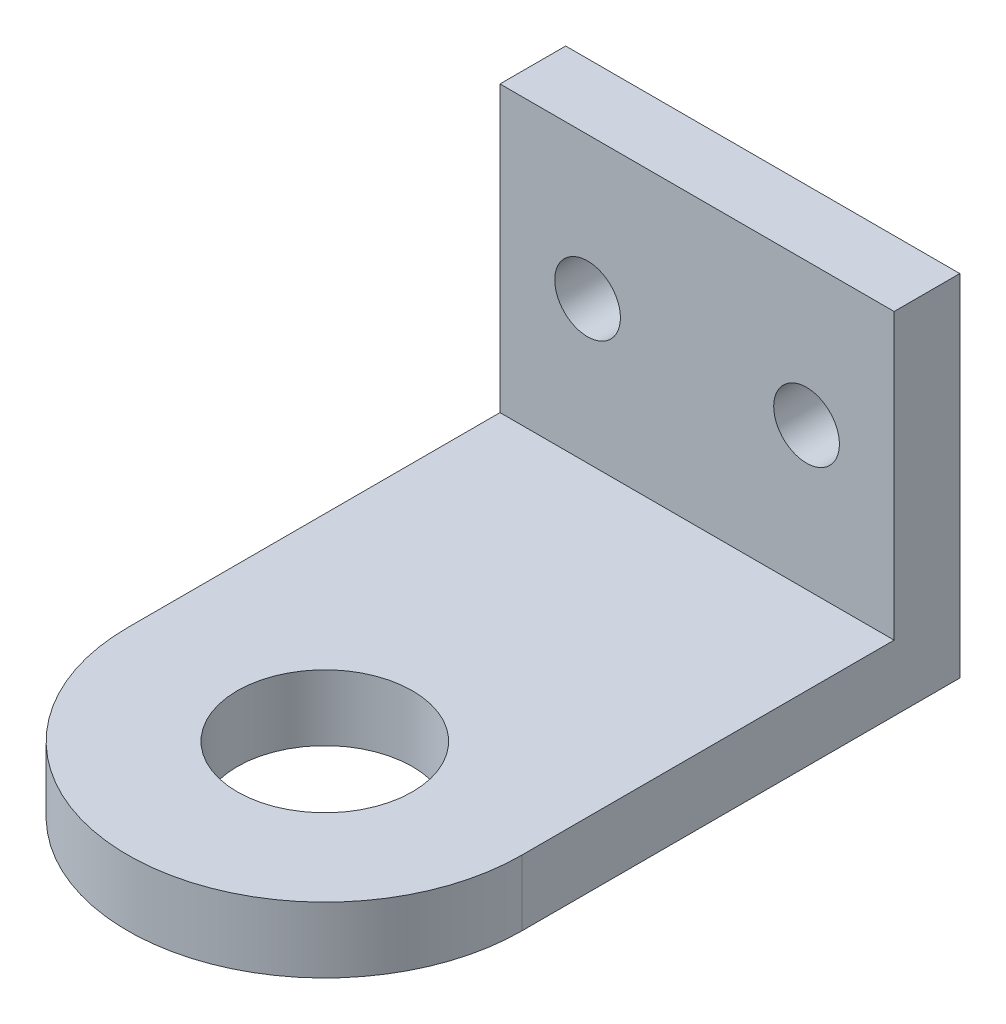
ISO-10303-21;
HEADER;
FILE_DESCRIPTION(('STEP AP214'),'2;1');
FILE_NAME('part.step','',(''),(''),'','','');
FILE_SCHEMA(('AUTOMOTIVE_DESIGN { 1 0 10303 214 1 1 1 1 }'));
ENDSEC;
DATA;
#1=APPLICATION_CONTEXT('core data for automotive mechanical design processes');
#2=APPLICATION_PROTOCOL_DEFINITION('international standard','automotive_design',2000,#1);
#3=PRODUCT_CONTEXT('',#1,'mechanical');
#4=PRODUCT('Part','Part','',(#3));
#5=PRODUCT_RELATED_PRODUCT_CATEGORY('part','',(#4));
#6=PRODUCT_DEFINITION_FORMATION('','',#4);
#7=PRODUCT_DEFINITION_CONTEXT('part definition',#1,'design');
#8=PRODUCT_DEFINITION('design','',#6,#7);
#9=PRODUCT_DEFINITION_SHAPE('','',#8);
#10=(LENGTH_UNIT() NAMED_UNIT(*) SI_UNIT(.MILLI.,.METRE.));
#11=(NAMED_UNIT(*) PLANE_ANGLE_UNIT() SI_UNIT($,.RADIAN.));
#12=(NAMED_UNIT(*) SI_UNIT($,.STERADIAN.) SOLID_ANGLE_UNIT());
#13=UNCERTAINTY_MEASURE_WITH_UNIT(LENGTH_MEASURE(1.E-05),#10,'distance_accuracy_value','');
#14=(GEOMETRIC_REPRESENTATION_CONTEXT(3) GLOBAL_UNCERTAINTY_ASSIGNED_CONTEXT((#13)) GLOBAL_UNIT_ASSIGNED_CONTEXT((#10,
#11,#12)) REPRESENTATION_CONTEXT('',''));
#15=CARTESIAN_POINT('',(0.,0.,0.));
#16=DIRECTION('',(0.,0.,1.));
#17=DIRECTION('',(1.,0.,0.));
#18=AXIS2_PLACEMENT_3D('',#15,#16,#17);
#19=CARTESIAN_POINT('',(0.,0.,3.));
#20=DIRECTION('',(0.,0.,1.));
#21=DIRECTION('',(1.,0.,0.));
#22=AXIS2_PLACEMENT_3D('',#19,#20,#21);
#23=PLANE('',#22);
#24=CARTESIAN_POINT('',(4.99999999999999,1.5,3.));
#25=DIRECTION('',(0.,0.,1.));
#26=DIRECTION('',(-1.,0.,0.));
#27=AXIS2_PLACEMENT_3D('',#24,#25,#26);
#28=CIRCLE('',#27,1.5);
#29=CARTESIAN_POINT('',(3.49999999999999,1.5,3.));
#30=VERTEX_POINT('',#29);
#31=EDGE_CURVE('E118',#30,#30,#28,.T.);
#32=ORIENTED_EDGE('',*,*,#31,.F.);
#33=EDGE_LOOP('',(#32));
#34=FACE_BOUND('',#33,.T.);
#35=CARTESIAN_POINT('',(-5.,1.5,3.));
#36=DIRECTION('',(0.,0.,1.));
#37=DIRECTION('',(1.,0.,0.));
#38=AXIS2_PLACEMENT_3D('',#35,#36,#37);
#39=CIRCLE('',#38,1.5);
#40=CARTESIAN_POINT('',(-3.5,1.5,3.));
#41=VERTEX_POINT('',#40);
#42=EDGE_CURVE('E124',#41,#41,#39,.T.);
#43=ORIENTED_EDGE('',*,*,#42,.F.);
#44=EDGE_LOOP('',(#43));
#45=FACE_BOUND('',#44,.T.);
#46=DIRECTION('',(0.,-1.,0.));
#47=VECTOR('',#46,1.);
#48=CARTESIAN_POINT('',(-9.,8.,3.));
#49=LINE('',#48,#47);
#50=CARTESIAN_POINT('',(-9.,8.,3.));
#51=VERTEX_POINT('',#50);
#52=CARTESIAN_POINT('',(-9.,-5.,3.));
#53=VERTEX_POINT('',#52);
#54=EDGE_CURVE('E55',#51,#53,#49,.T.);
#55=ORIENTED_EDGE('',*,*,#54,.T.);
#56=DIRECTION('',(1.,0.,0.));
#57=VECTOR('',#56,1.);
#58=CARTESIAN_POINT('',(0.,-5.,3.));
#59=LINE('',#58,#57);
#60=CARTESIAN_POINT('',(9.,-5.,3.));
#61=VERTEX_POINT('',#60);
#62=EDGE_CURVE('E50',#53,#61,#59,.T.);
#63=ORIENTED_EDGE('',*,*,#62,.T.);
#64=DIRECTION('',(0.,1.,0.));
#65=VECTOR('',#64,1.);
#66=CARTESIAN_POINT('',(9.,8.,3.));
#67=LINE('',#66,#65);
#68=CARTESIAN_POINT('',(9.,8.,3.));
#69=VERTEX_POINT('',#68);
#70=EDGE_CURVE('E92',#61,#69,#67,.T.);
#71=ORIENTED_EDGE('',*,*,#70,.T.);
#72=DIRECTION('',(-1.,0.,0.));
#73=VECTOR('',#72,1.);
#74=CARTESIAN_POINT('',(-9.,8.,3.));
#75=LINE('',#74,#73);
#76=EDGE_CURVE('E131',#69,#51,#75,.T.);
#77=ORIENTED_EDGE('',*,*,#76,.T.);
#78=EDGE_LOOP('',(#55,#63,#71,#77));
#79=FACE_BOUND('',#78,.T.);
#80=ADVANCED_FACE('F35',(#34,#45,#79),#23,.T.);
#81=CARTESIAN_POINT('',(0.,0.,0.));
#82=DIRECTION('',(0.,0.,1.));
#83=DIRECTION('',(1.,0.,0.));
#84=AXIS2_PLACEMENT_3D('',#81,#82,#83);
#85=PLANE('',#84);
#86=DIRECTION('',(1.,0.,0.));
#87=VECTOR('',#86,1.);
#88=CARTESIAN_POINT('',(-9.,-8.,0.));
#89=LINE('',#88,#87);
#90=CARTESIAN_POINT('',(-9.,-8.,0.));
#91=VERTEX_POINT('',#90);
#92=CARTESIAN_POINT('',(9.,-8.,0.));
#93=VERTEX_POINT('',#92);
#94=EDGE_CURVE('E132',#91,#93,#89,.T.);
#95=ORIENTED_EDGE('',*,*,#94,.F.);
#96=DIRECTION('',(0.,-1.,0.));
#97=VECTOR('',#96,1.);
#98=CARTESIAN_POINT('',(-9.,8.,0.));
#99=LINE('',#98,#97);
#100=CARTESIAN_POINT('',(-9.,8.,0.));
#101=VERTEX_POINT('',#100);
#102=EDGE_CURVE('E139',#101,#91,#99,.T.);
#103=ORIENTED_EDGE('',*,*,#102,.F.);
#104=DIRECTION('',(-1.,0.,0.));
#105=VECTOR('',#104,1.);
#106=CARTESIAN_POINT('',(-9.,8.,0.));
#107=LINE('',#106,#105);
#108=CARTESIAN_POINT('',(9.,8.,0.));
#109=VERTEX_POINT('',#108);
#110=EDGE_CURVE('E137',#109,#101,#107,.T.);
#111=ORIENTED_EDGE('',*,*,#110,.F.);
#112=DIRECTION('',(0.,1.,0.));
#113=VECTOR('',#112,1.);
#114=CARTESIAN_POINT('',(9.,8.,0.));
#115=LINE('',#114,#113);
#116=EDGE_CURVE('E127',#93,#109,#115,.T.);
#117=ORIENTED_EDGE('',*,*,#116,.F.);
#118=EDGE_LOOP('',(#95,#103,#111,#117));
#119=FACE_BOUND('',#118,.T.);
#120=CARTESIAN_POINT('',(4.99999999999999,1.5,0.));
#121=DIRECTION('',(0.,0.,1.));
#122=DIRECTION('',(-1.,0.,0.));
#123=AXIS2_PLACEMENT_3D('',#120,#121,#122);
#124=CIRCLE('',#123,1.5);
#125=CARTESIAN_POINT('',(3.49999999999999,1.5,0.));
#126=VERTEX_POINT('',#125);
#127=EDGE_CURVE('E117',#126,#126,#124,.T.);
#128=ORIENTED_EDGE('',*,*,#127,.T.);
#129=EDGE_LOOP('',(#128));
#130=FACE_BOUND('',#129,.T.);
#131=CARTESIAN_POINT('',(-5.,1.5,0.));
#132=DIRECTION('',(0.,0.,1.));
#133=DIRECTION('',(1.,0.,0.));
#134=AXIS2_PLACEMENT_3D('',#131,#132,#133);
#135=CIRCLE('',#134,1.5);
#136=CARTESIAN_POINT('',(-3.5,1.5,0.));
#137=VERTEX_POINT('',#136);
#138=EDGE_CURVE('E121',#137,#137,#135,.T.);
#139=ORIENTED_EDGE('',*,*,#138,.T.);
#140=EDGE_LOOP('',(#139));
#141=FACE_BOUND('',#140,.T.);
#142=ADVANCED_FACE('F155',(#119,#130,#141),#85,.F.);
#143=CARTESIAN_POINT('',(9.,8.,3.));
#144=DIRECTION('',(-1.,0.,0.));
#145=DIRECTION('',(0.,0.,1.));
#146=AXIS2_PLACEMENT_3D('',#143,#144,#145);
#147=PLANE('',#146);
#148=ORIENTED_EDGE('',*,*,#116,.T.);
#149=DIRECTION('',(0.,0.,-1.));
#150=VECTOR('',#149,1.);
#151=CARTESIAN_POINT('',(9.,8.,3.));
#152=LINE('',#151,#150);
#153=EDGE_CURVE('E11',#69,#109,#152,.T.);
#154=ORIENTED_EDGE('',*,*,#153,.F.);
#155=ORIENTED_EDGE('',*,*,#70,.F.);
#156=DIRECTION('',(0.,0.,1.));
#157=VECTOR('',#156,1.);
#158=CARTESIAN_POINT('',(9.,-5.,0.));
#159=LINE('',#158,#157);
#160=CARTESIAN_POINT('',(9.,-5.,20.));
#161=VERTEX_POINT('',#160);
#162=EDGE_CURVE('E86',#61,#161,#159,.T.);
#163=ORIENTED_EDGE('',*,*,#162,.T.);
#164=DIRECTION('',(0.,-1.,0.));
#165=VECTOR('',#164,1.);
#166=CARTESIAN_POINT('',(9.,-5.,20.));
#167=LINE('',#166,#165);
#168=CARTESIAN_POINT('',(9.,-8.,20.));
#169=VERTEX_POINT('',#168);
#170=EDGE_CURVE('E89',#161,#169,#167,.T.);
#171=ORIENTED_EDGE('',*,*,#170,.T.);
#172=DIRECTION('',(0.,0.,-1.));
#173=VECTOR('',#172,1.);
#174=CARTESIAN_POINT('',(9.,-8.,3.));
#175=LINE('',#174,#173);
#176=EDGE_CURVE('E135',#169,#93,#175,.T.);
#177=ORIENTED_EDGE('',*,*,#176,.T.);
#178=EDGE_LOOP('',(#148,#154,#155,#163,#171,#177));
#179=FACE_BOUND('',#178,.T.);
#180=ADVANCED_FACE('F37',(#179),#147,.F.);
#181=CARTESIAN_POINT('',(-9.,8.,3.));
#182=DIRECTION('',(0.,-1.,0.));
#183=DIRECTION('',(0.,0.,-1.));
#184=AXIS2_PLACEMENT_3D('',#181,#182,#183);
#185=PLANE('',#184);
#186=ORIENTED_EDGE('',*,*,#110,.T.);
#187=DIRECTION('',(0.,0.,-1.));
#188=VECTOR('',#187,1.);
#189=CARTESIAN_POINT('',(-9.,8.,3.));
#190=LINE('',#189,#188);
#191=EDGE_CURVE('E43',#51,#101,#190,.T.);
#192=ORIENTED_EDGE('',*,*,#191,.F.);
#193=ORIENTED_EDGE('',*,*,#76,.F.);
#194=ORIENTED_EDGE('',*,*,#153,.T.);
#195=EDGE_LOOP('',(#186,#192,#193,#194));
#196=FACE_BOUND('',#195,.T.);
#197=ADVANCED_FACE('F161',(#196),#185,.F.);
#198=CARTESIAN_POINT('',(-9.,8.,3.));
#199=DIRECTION('',(1.,0.,0.));
#200=DIRECTION('',(0.,0.,-1.));
#201=AXIS2_PLACEMENT_3D('',#198,#199,#200);
#202=PLANE('',#201);
#203=DIRECTION('',(0.,0.,-1.));
#204=VECTOR('',#203,1.);
#205=CARTESIAN_POINT('',(-9.,-8.,3.));
#206=LINE('',#205,#204);
#207=CARTESIAN_POINT('',(-9.,-8.,20.));
#208=VERTEX_POINT('',#207);
#209=EDGE_CURVE('E143',#208,#91,#206,.T.);
#210=ORIENTED_EDGE('',*,*,#209,.F.);
#211=DIRECTION('',(0.,-1.,0.));
#212=VECTOR('',#211,1.);
#213=CARTESIAN_POINT('',(-9.,-5.,20.));
#214=LINE('',#213,#212);
#215=CARTESIAN_POINT('',(-9.,-5.,20.));
#216=VERTEX_POINT('',#215);
#217=EDGE_CURVE('E104',#216,#208,#214,.T.);
#218=ORIENTED_EDGE('',*,*,#217,.F.);
#219=DIRECTION('',(0.,0.,-1.));
#220=VECTOR('',#219,1.);
#221=CARTESIAN_POINT('',(-9.,-5.,20.));
#222=LINE('',#221,#220);
#223=EDGE_CURVE('E96',#216,#53,#222,.T.);
#224=ORIENTED_EDGE('',*,*,#223,.T.);
#225=ORIENTED_EDGE('',*,*,#54,.F.);
#226=ORIENTED_EDGE('',*,*,#191,.T.);
#227=ORIENTED_EDGE('',*,*,#102,.T.);
#228=EDGE_LOOP('',(#210,#218,#224,#225,#226,#227));
#229=FACE_BOUND('',#228,.T.);
#230=ADVANCED_FACE('F149',(#229),#202,.F.);
#231=CARTESIAN_POINT('',(-9.,-8.,3.));
#232=DIRECTION('',(0.,1.,0.));
#233=DIRECTION('',(0.,0.,1.));
#234=AXIS2_PLACEMENT_3D('',#231,#232,#233);
#235=PLANE('',#234);
#236=ORIENTED_EDGE('',*,*,#94,.T.);
#237=ORIENTED_EDGE('',*,*,#176,.F.);
#238=CARTESIAN_POINT('',(0.,-8.,20.));
#239=DIRECTION('',(0.,-1.,0.));
#240=DIRECTION('',(0.,0.,-1.));
#241=AXIS2_PLACEMENT_3D('',#238,#239,#240);
#242=CIRCLE('',#241,9.);
#243=EDGE_CURVE('E103',#169,#208,#242,.T.);
#244=ORIENTED_EDGE('',*,*,#243,.T.);
#245=ORIENTED_EDGE('',*,*,#209,.T.);
#246=EDGE_LOOP('',(#236,#237,#244,#245));
#247=FACE_BOUND('',#246,.T.);
#248=CARTESIAN_POINT('',(0.,-8.,20.));
#249=DIRECTION('',(0.,-1.,0.));
#250=DIRECTION('',(0.,0.,-1.));
#251=AXIS2_PLACEMENT_3D('',#248,#249,#250);
#252=CIRCLE('',#251,4.);
#253=CARTESIAN_POINT('',(0.,-8.,16.));
#254=VERTEX_POINT('',#253);
#255=EDGE_CURVE('E266',#254,#254,#252,.T.);
#256=ORIENTED_EDGE('',*,*,#255,.F.);
#257=EDGE_LOOP('',(#256));
#258=FACE_BOUND('',#257,.T.);
#259=ADVANCED_FACE('F159',(#247,#258),#235,.F.);
#260=CARTESIAN_POINT('',(-5.,1.5,3.));
#261=DIRECTION('',(0.,0.,-1.));
#262=DIRECTION('',(-1.,0.,0.));
#263=AXIS2_PLACEMENT_3D('',#260,#261,#262);
#264=CYLINDRICAL_SURFACE('',#263,1.5);
#265=ORIENTED_EDGE('',*,*,#42,.T.);
#266=EDGE_LOOP('',(#265));
#267=FACE_BOUND('',#266,.T.);
#268=ORIENTED_EDGE('',*,*,#138,.F.);
#269=EDGE_LOOP('',(#268));
#270=FACE_BOUND('',#269,.T.);
#271=ADVANCED_FACE('F172',(#267,#270),#264,.F.);
#272=CARTESIAN_POINT('',(4.99999999999999,1.5,3.));
#273=DIRECTION('',(0.,0.,-1.));
#274=DIRECTION('',(-1.,0.,0.));
#275=AXIS2_PLACEMENT_3D('',#272,#273,#274);
#276=CYLINDRICAL_SURFACE('',#275,1.5);
#277=ORIENTED_EDGE('',*,*,#31,.T.);
#278=EDGE_LOOP('',(#277));
#279=FACE_BOUND('',#278,.T.);
#280=ORIENTED_EDGE('',*,*,#127,.F.);
#281=EDGE_LOOP('',(#280));
#282=FACE_BOUND('',#281,.T.);
#283=ADVANCED_FACE('F200',(#279,#282),#276,.F.);
#284=CARTESIAN_POINT('',(0.,-5.,20.));
#285=DIRECTION('',(0.,-1.,0.));
#286=DIRECTION('',(0.,0.,-1.));
#287=AXIS2_PLACEMENT_3D('',#284,#285,#286);
#288=CYLINDRICAL_SURFACE('',#287,9.);
#289=ORIENTED_EDGE('',*,*,#243,.F.);
#290=ORIENTED_EDGE('',*,*,#170,.F.);
#291=CARTESIAN_POINT('',(0.,-5.,20.));
#292=DIRECTION('',(0.,-1.,0.));
#293=DIRECTION('',(0.,0.,-1.));
#294=AXIS2_PLACEMENT_3D('',#291,#292,#293);
#295=CIRCLE('',#294,9.);
#296=EDGE_CURVE('E95',#161,#216,#295,.T.);
#297=ORIENTED_EDGE('',*,*,#296,.T.);
#298=ORIENTED_EDGE('',*,*,#217,.T.);
#299=EDGE_LOOP('',(#289,#290,#297,#298));
#300=FACE_BOUND('',#299,.T.);
#301=ADVANCED_FACE('F100',(#300),#288,.T.);
#302=CARTESIAN_POINT('',(0.,-5.,20.));
#303=DIRECTION('',(0.,-1.,0.));
#304=DIRECTION('',(0.,0.,-1.));
#305=AXIS2_PLACEMENT_3D('',#302,#303,#304);
#306=PLANE('',#305);
#307=ORIENTED_EDGE('',*,*,#62,.F.);
#308=ORIENTED_EDGE('',*,*,#223,.F.);
#309=ORIENTED_EDGE('',*,*,#296,.F.);
#310=ORIENTED_EDGE('',*,*,#162,.F.);
#311=EDGE_LOOP('',(#307,#308,#309,#310));
#312=FACE_BOUND('',#311,.T.);
#313=CARTESIAN_POINT('',(0.,-5.,20.));
#314=DIRECTION('',(0.,-1.,0.));
#315=DIRECTION('',(0.,0.,-1.));
#316=AXIS2_PLACEMENT_3D('',#313,#314,#315);
#317=CIRCLE('',#316,4.);
#318=CARTESIAN_POINT('',(0.,-5.,16.));
#319=VERTEX_POINT('',#318);
#320=EDGE_CURVE('E114',#319,#319,#317,.T.);
#321=ORIENTED_EDGE('',*,*,#320,.T.);
#322=EDGE_LOOP('',(#321));
#323=FACE_BOUND('',#322,.T.);
#324=ADVANCED_FACE('F107',(#312,#323),#306,.F.);
#325=CARTESIAN_POINT('',(0.,-5.,20.));
#326=DIRECTION('',(0.,-1.,0.));
#327=DIRECTION('',(0.,0.,-1.));
#328=AXIS2_PLACEMENT_3D('',#325,#326,#327);
#329=CYLINDRICAL_SURFACE('',#328,4.);
#330=ORIENTED_EDGE('',*,*,#320,.F.);
#331=EDGE_LOOP('',(#330));
#332=FACE_BOUND('',#331,.T.);
#333=ORIENTED_EDGE('',*,*,#255,.T.);
#334=EDGE_LOOP('',(#333));
#335=FACE_BOUND('',#334,.T.);
#336=ADVANCED_FACE('F248',(#332,#335),#329,.F.);
#337=CLOSED_SHELL('',(#80,#142,#180,#197,#230,#259,#271,#283,#301,#324,#336));
#338=MANIFOLD_SOLID_BREP('B2',#337);
#339=ADVANCED_BREP_SHAPE_REPRESENTATION('',(#18,#338),#14);
#340=SHAPE_DEFINITION_REPRESENTATION(#9,#339);
ENDSEC;
END-ISO-10303-21;
